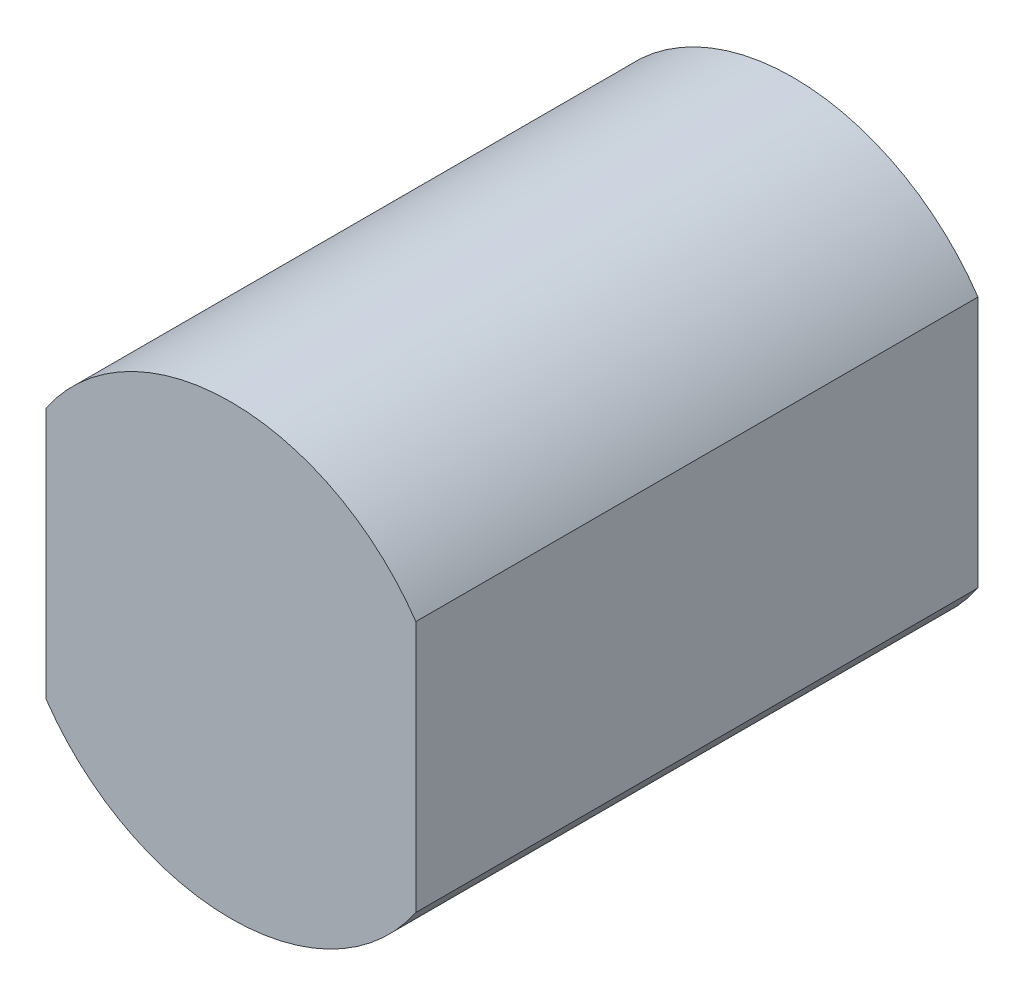
ISO-10303-21;
HEADER;
FILE_DESCRIPTION(('STEP AP214'),'2;1');
FILE_NAME('part.step','',(''),(''),'','','');
FILE_SCHEMA(('AUTOMOTIVE_DESIGN { 1 0 10303 214 1 1 1 1 }'));
ENDSEC;
DATA;
#1=APPLICATION_CONTEXT('core data for automotive mechanical design processes');
#2=APPLICATION_PROTOCOL_DEFINITION('international standard','automotive_design',2000,#1);
#3=PRODUCT_CONTEXT('',#1,'mechanical');
#4=PRODUCT('Part','Part','',(#3));
#5=PRODUCT_RELATED_PRODUCT_CATEGORY('part','',(#4));
#6=PRODUCT_DEFINITION_FORMATION('','',#4);
#7=PRODUCT_DEFINITION_CONTEXT('part definition',#1,'design');
#8=PRODUCT_DEFINITION('design','',#6,#7);
#9=PRODUCT_DEFINITION_SHAPE('','',#8);
#10=(LENGTH_UNIT() NAMED_UNIT(*) SI_UNIT(.MILLI.,.METRE.));
#11=(NAMED_UNIT(*) PLANE_ANGLE_UNIT() SI_UNIT($,.RADIAN.));
#12=(NAMED_UNIT(*) SI_UNIT($,.STERADIAN.) SOLID_ANGLE_UNIT());
#13=UNCERTAINTY_MEASURE_WITH_UNIT(LENGTH_MEASURE(1.E-05),#10,'distance_accuracy_value','');
#14=(GEOMETRIC_REPRESENTATION_CONTEXT(3) GLOBAL_UNCERTAINTY_ASSIGNED_CONTEXT((#13)) GLOBAL_UNIT_ASSIGNED_CONTEXT((#10,
#11,#12)) REPRESENTATION_CONTEXT('',''));
#15=CARTESIAN_POINT('',(0.,0.,0.));
#16=DIRECTION('',(0.,0.,1.));
#17=DIRECTION('',(1.,0.,0.));
#18=AXIS2_PLACEMENT_3D('',#15,#16,#17);
#19=CARTESIAN_POINT('',(0.,0.,15.2));
#20=DIRECTION('',(0.,0.,-1.));
#21=DIRECTION('',(-1.,0.,0.));
#22=AXIS2_PLACEMENT_3D('',#19,#20,#21);
#23=CYLINDRICAL_SURFACE('',#22,6.05);
#24=CARTESIAN_POINT('',(0.,0.,0.));
#25=DIRECTION('',(0.,0.,1.));
#26=DIRECTION('',(1.,0.,0.));
#27=AXIS2_PLACEMENT_3D('',#24,#25,#26);
#28=CIRCLE('',#27,6.05);
#29=CARTESIAN_POINT('',(-5.,-3.40624426605022,0.));
#30=VERTEX_POINT('',#29);
#31=CARTESIAN_POINT('',(5.,-3.40624426605022,0.));
#32=VERTEX_POINT('',#31);
#33=EDGE_CURVE('E109',#30,#32,#28,.T.);
#34=ORIENTED_EDGE('',*,*,#33,.T.);
#35=DIRECTION('',(0.,0.,-1.));
#36=VECTOR('',#35,1.);
#37=CARTESIAN_POINT('',(5.,-3.40624426605022,15.2));
#38=LINE('',#37,#36);
#39=CARTESIAN_POINT('',(5.,-3.40624426605022,15.2));
#40=VERTEX_POINT('',#39);
#41=EDGE_CURVE('E11',#40,#32,#38,.T.);
#42=ORIENTED_EDGE('',*,*,#41,.F.);
#43=CARTESIAN_POINT('',(0.,0.,15.2));
#44=DIRECTION('',(0.,0.,1.));
#45=DIRECTION('',(1.,0.,0.));
#46=AXIS2_PLACEMENT_3D('',#43,#44,#45);
#47=CIRCLE('',#46,6.05);
#48=CARTESIAN_POINT('',(-5.,-3.40624426605022,15.2));
#49=VERTEX_POINT('',#48);
#50=EDGE_CURVE('E93',#49,#40,#47,.T.);
#51=ORIENTED_EDGE('',*,*,#50,.F.);
#52=DIRECTION('',(0.,0.,-1.));
#53=VECTOR('',#52,1.);
#54=CARTESIAN_POINT('',(-5.,-3.40624426605022,15.2));
#55=LINE('',#54,#53);
#56=EDGE_CURVE('E105',#49,#30,#55,.T.);
#57=ORIENTED_EDGE('',*,*,#56,.T.);
#58=EDGE_LOOP('',(#34,#42,#51,#57));
#59=FACE_BOUND('',#58,.T.);
#60=ADVANCED_FACE('F41',(#59),#23,.T.);
#61=CARTESIAN_POINT('',(5.,-3.40624426605022,15.2));
#62=DIRECTION('',(-1.,0.,0.));
#63=DIRECTION('',(0.,0.,1.));
#64=AXIS2_PLACEMENT_3D('',#61,#62,#63);
#65=PLANE('',#64);
#66=DIRECTION('',(0.,1.,0.));
#67=VECTOR('',#66,1.);
#68=CARTESIAN_POINT('',(5.,-3.40624426605022,0.));
#69=LINE('',#68,#67);
#70=CARTESIAN_POINT('',(5.,3.40624426605022,0.));
#71=VERTEX_POINT('',#70);
#72=EDGE_CURVE('E98',#32,#71,#69,.T.);
#73=ORIENTED_EDGE('',*,*,#72,.T.);
#74=DIRECTION('',(0.,0.,-1.));
#75=VECTOR('',#74,1.);
#76=CARTESIAN_POINT('',(5.,3.40624426605022,15.2));
#77=LINE('',#76,#75);
#78=CARTESIAN_POINT('',(5.,3.40624426605022,15.2));
#79=VERTEX_POINT('',#78);
#80=EDGE_CURVE('E50',#79,#71,#77,.T.);
#81=ORIENTED_EDGE('',*,*,#80,.F.);
#82=DIRECTION('',(0.,1.,0.));
#83=VECTOR('',#82,1.);
#84=CARTESIAN_POINT('',(5.,-3.40624426605022,15.2));
#85=LINE('',#84,#83);
#86=EDGE_CURVE('E88',#40,#79,#85,.T.);
#87=ORIENTED_EDGE('',*,*,#86,.F.);
#88=ORIENTED_EDGE('',*,*,#41,.T.);
#89=EDGE_LOOP('',(#73,#81,#87,#88));
#90=FACE_BOUND('',#89,.T.);
#91=ADVANCED_FACE('F97',(#90),#65,.F.);
#92=CARTESIAN_POINT('',(0.,0.,15.2));
#93=DIRECTION('',(0.,0.,-1.));
#94=DIRECTION('',(-1.,0.,0.));
#95=AXIS2_PLACEMENT_3D('',#92,#93,#94);
#96=CYLINDRICAL_SURFACE('',#95,6.05);
#97=CARTESIAN_POINT('',(0.,0.,0.));
#98=DIRECTION('',(0.,0.,1.));
#99=DIRECTION('',(1.,0.,0.));
#100=AXIS2_PLACEMENT_3D('',#97,#98,#99);
#101=CIRCLE('',#100,6.05);
#102=CARTESIAN_POINT('',(-5.,3.40624426605022,0.));
#103=VERTEX_POINT('',#102);
#104=EDGE_CURVE('E75',#71,#103,#101,.T.);
#105=ORIENTED_EDGE('',*,*,#104,.T.);
#106=DIRECTION('',(0.,0.,-1.));
#107=VECTOR('',#106,1.);
#108=CARTESIAN_POINT('',(-5.,3.40624426605022,15.2));
#109=LINE('',#108,#107);
#110=CARTESIAN_POINT('',(-5.,3.40624426605022,15.2));
#111=VERTEX_POINT('',#110);
#112=EDGE_CURVE('E100',#111,#103,#109,.T.);
#113=ORIENTED_EDGE('',*,*,#112,.F.);
#114=CARTESIAN_POINT('',(0.,0.,15.2));
#115=DIRECTION('',(0.,0.,1.));
#116=DIRECTION('',(1.,0.,0.));
#117=AXIS2_PLACEMENT_3D('',#114,#115,#116);
#118=CIRCLE('',#117,6.05);
#119=EDGE_CURVE('E91',#79,#111,#118,.T.);
#120=ORIENTED_EDGE('',*,*,#119,.F.);
#121=ORIENTED_EDGE('',*,*,#80,.T.);
#122=EDGE_LOOP('',(#105,#113,#120,#121));
#123=FACE_BOUND('',#122,.T.);
#124=ADVANCED_FACE('F101',(#123),#96,.T.);
#125=CARTESIAN_POINT('',(-5.,-3.40624426605022,15.2));
#126=DIRECTION('',(1.,0.,0.));
#127=DIRECTION('',(0.,0.,-1.));
#128=AXIS2_PLACEMENT_3D('',#125,#126,#127);
#129=PLANE('',#128);
#130=DIRECTION('',(0.,-1.,0.));
#131=VECTOR('',#130,1.);
#132=CARTESIAN_POINT('',(-5.,-3.40624426605022,0.));
#133=LINE('',#132,#131);
#134=EDGE_CURVE('E81',#103,#30,#133,.T.);
#135=ORIENTED_EDGE('',*,*,#134,.T.);
#136=ORIENTED_EDGE('',*,*,#56,.F.);
#137=DIRECTION('',(0.,-1.,0.));
#138=VECTOR('',#137,1.);
#139=CARTESIAN_POINT('',(-5.,-3.40624426605022,15.2));
#140=LINE('',#139,#138);
#141=EDGE_CURVE('E58',#111,#49,#140,.T.);
#142=ORIENTED_EDGE('',*,*,#141,.F.);
#143=ORIENTED_EDGE('',*,*,#112,.T.);
#144=EDGE_LOOP('',(#135,#136,#142,#143));
#145=FACE_BOUND('',#144,.T.);
#146=ADVANCED_FACE('F122',(#145),#129,.F.);
#147=CARTESIAN_POINT('',(0.,0.,15.2));
#148=DIRECTION('',(0.,0.,1.));
#149=DIRECTION('',(1.,0.,0.));
#150=AXIS2_PLACEMENT_3D('',#147,#148,#149);
#151=PLANE('',#150);
#152=ORIENTED_EDGE('',*,*,#50,.T.);
#153=ORIENTED_EDGE('',*,*,#86,.T.);
#154=ORIENTED_EDGE('',*,*,#119,.T.);
#155=ORIENTED_EDGE('',*,*,#141,.T.);
#156=EDGE_LOOP('',(#152,#153,#154,#155));
#157=FACE_BOUND('',#156,.T.);
#158=ADVANCED_FACE('F89',(#157),#151,.T.);
#159=CARTESIAN_POINT('',(0.,0.,0.));
#160=DIRECTION('',(0.,0.,1.));
#161=DIRECTION('',(1.,0.,0.));
#162=AXIS2_PLACEMENT_3D('',#159,#160,#161);
#163=PLANE('',#162);
#164=ORIENTED_EDGE('',*,*,#33,.F.);
#165=ORIENTED_EDGE('',*,*,#134,.F.);
#166=ORIENTED_EDGE('',*,*,#104,.F.);
#167=ORIENTED_EDGE('',*,*,#72,.F.);
#168=EDGE_LOOP('',(#164,#165,#166,#167));
#169=FACE_BOUND('',#168,.T.);
#170=ADVANCED_FACE('F125',(#169),#163,.F.);
#171=CLOSED_SHELL('',(#60,#91,#124,#146,#158,#170));
#172=MANIFOLD_SOLID_BREP('B2',#171);
#173=ADVANCED_BREP_SHAPE_REPRESENTATION('',(#18,#172),#14);
#174=SHAPE_DEFINITION_REPRESENTATION(#9,#173);
ENDSEC;
END-ISO-10303-21;
